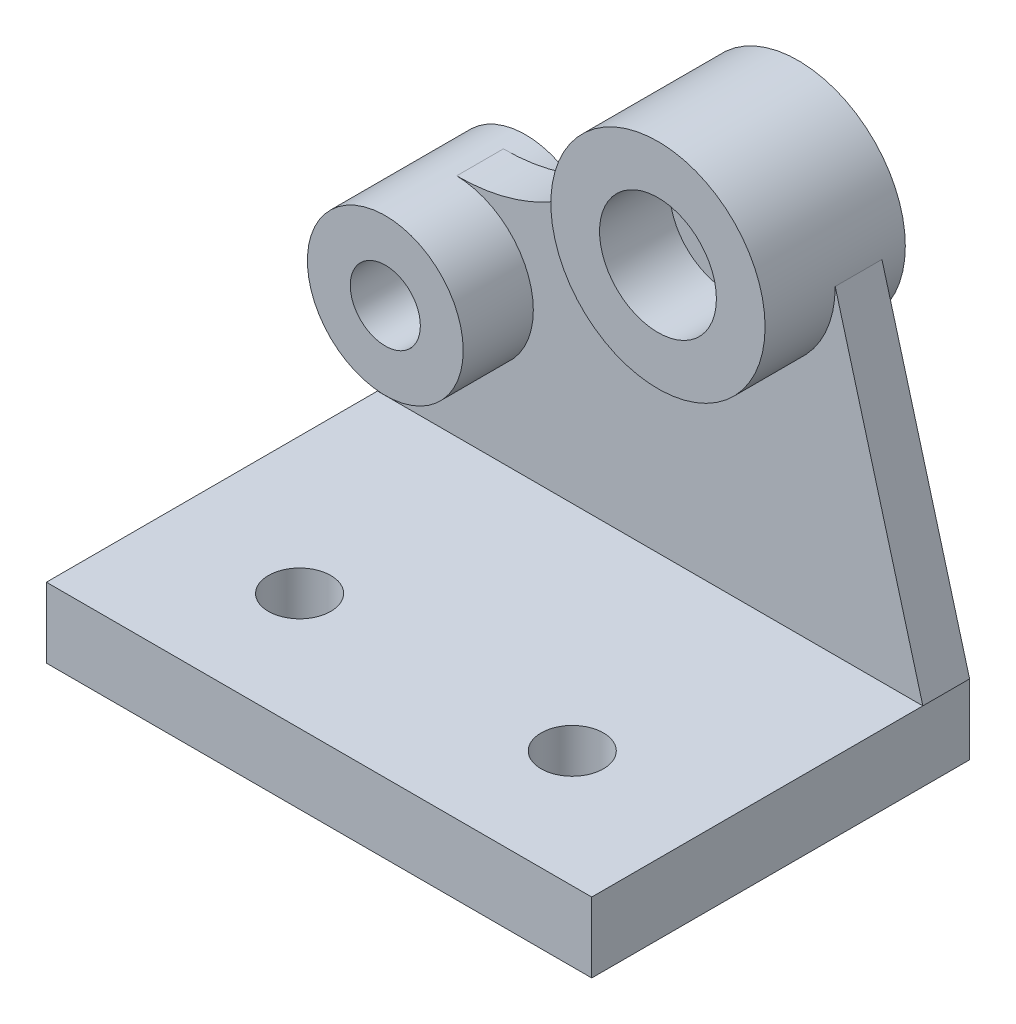
ISO-10303-21;
HEADER;
FILE_DESCRIPTION(('STEP AP214'),'2;1');
FILE_NAME('part.step','',(''),(''),'','','');
FILE_SCHEMA(('AUTOMOTIVE_DESIGN { 1 0 10303 214 1 1 1 1 }'));
ENDSEC;
DATA;
#1=APPLICATION_CONTEXT('core data for automotive mechanical design processes');
#2=APPLICATION_PROTOCOL_DEFINITION('international standard','automotive_design',2000,#1);
#3=PRODUCT_CONTEXT('',#1,'mechanical');
#4=PRODUCT('Part','Part','',(#3));
#5=PRODUCT_RELATED_PRODUCT_CATEGORY('part','',(#4));
#6=PRODUCT_DEFINITION_FORMATION('','',#4);
#7=PRODUCT_DEFINITION_CONTEXT('part definition',#1,'design');
#8=PRODUCT_DEFINITION('design','',#6,#7);
#9=PRODUCT_DEFINITION_SHAPE('','',#8);
#10=(LENGTH_UNIT() NAMED_UNIT(*) SI_UNIT(.MILLI.,.METRE.));
#11=(NAMED_UNIT(*) PLANE_ANGLE_UNIT() SI_UNIT($,.RADIAN.));
#12=(NAMED_UNIT(*) SI_UNIT($,.STERADIAN.) SOLID_ANGLE_UNIT());
#13=UNCERTAINTY_MEASURE_WITH_UNIT(LENGTH_MEASURE(1.E-05),#10,'distance_accuracy_value','');
#14=(GEOMETRIC_REPRESENTATION_CONTEXT(3) GLOBAL_UNCERTAINTY_ASSIGNED_CONTEXT((#13)) GLOBAL_UNIT_ASSIGNED_CONTEXT((#10,
#11,#12)) REPRESENTATION_CONTEXT('',''));
#15=CARTESIAN_POINT('',(0.,0.,0.));
#16=DIRECTION('',(0.,0.,1.));
#17=DIRECTION('',(1.,0.,0.));
#18=AXIS2_PLACEMENT_3D('',#15,#16,#17);
#19=CARTESIAN_POINT('',(0.,18.,85.));
#20=DIRECTION('',(1.,0.,0.));
#21=DIRECTION('',(0.,1.,0.));
#22=AXIS2_PLACEMENT_3D('',#19,#20,#21);
#23=PLANE('',#22);
#24=DIRECTION('',(0.,1.,0.));
#25=VECTOR('',#24,1.);
#26=CARTESIAN_POINT('',(0.,100.,0.));
#27=LINE('',#26,#25);
#28=CARTESIAN_POINT('',(0.,18.,0.));
#29=VERTEX_POINT('',#28);
#30=CARTESIAN_POINT('',(0.,56.,0.));
#31=VERTEX_POINT('',#30);
#32=EDGE_CURVE('E148',#29,#31,#27,.T.);
#33=ORIENTED_EDGE('',*,*,#32,.T.);
#34=DIRECTION('',(0.,0.,1.));
#35=VECTOR('',#34,1.);
#36=CARTESIAN_POINT('',(0.,56.,-12.));
#37=LINE('',#36,#35);
#38=CARTESIAN_POINT('',(0.,56.,-12.));
#39=VERTEX_POINT('',#38);
#40=EDGE_CURVE('E211',#39,#31,#37,.T.);
#41=ORIENTED_EDGE('',*,*,#40,.F.);
#42=DIRECTION('',(0.,1.,0.));
#43=VECTOR('',#42,1.);
#44=CARTESIAN_POINT('',(0.,100.,-12.));
#45=LINE('',#44,#43);
#46=CARTESIAN_POINT('',(0.,0.,-12.));
#47=VERTEX_POINT('',#46);
#48=EDGE_CURVE('E144',#47,#39,#45,.T.);
#49=ORIENTED_EDGE('',*,*,#48,.F.);
#50=DIRECTION('',(0.,0.,-1.));
#51=VECTOR('',#50,1.);
#52=CARTESIAN_POINT('',(0.,0.,85.));
#53=LINE('',#52,#51);
#54=CARTESIAN_POINT('',(0.,0.,85.));
#55=VERTEX_POINT('',#54);
#56=EDGE_CURVE('E183',#55,#47,#53,.T.);
#57=ORIENTED_EDGE('',*,*,#56,.F.);
#58=DIRECTION('',(0.,-1.,0.));
#59=VECTOR('',#58,1.);
#60=CARTESIAN_POINT('',(0.,18.,85.));
#61=LINE('',#60,#59);
#62=CARTESIAN_POINT('',(0.,18.,85.));
#63=VERTEX_POINT('',#62);
#64=EDGE_CURVE('E165',#63,#55,#61,.T.);
#65=ORIENTED_EDGE('',*,*,#64,.F.);
#66=DIRECTION('',(0.,0.,-1.));
#67=VECTOR('',#66,1.);
#68=CARTESIAN_POINT('',(0.,18.,85.));
#69=LINE('',#68,#67);
#70=EDGE_CURVE('E174',#63,#29,#69,.T.);
#71=ORIENTED_EDGE('',*,*,#70,.T.);
#72=EDGE_LOOP('',(#33,#41,#49,#57,#65,#71));
#73=FACE_BOUND('',#72,.T.);
#74=ADVANCED_FACE('F37',(#73),#23,.F.);
#75=CARTESIAN_POINT('',(0.,0.,85.));
#76=DIRECTION('',(0.,1.,0.));
#77=DIRECTION('',(0.,0.,1.));
#78=AXIS2_PLACEMENT_3D('',#75,#76,#77);
#79=PLANE('',#78);
#80=CARTESIAN_POINT('',(35.,0.,55.));
#81=DIRECTION('',(0.,1.,0.));
#82=DIRECTION('',(-1.,0.,0.));
#83=AXIS2_PLACEMENT_3D('',#80,#81,#82);
#84=CIRCLE('',#83,8.);
#85=CARTESIAN_POINT('',(27.,0.,55.));
#86=VERTEX_POINT('',#85);
#87=EDGE_CURVE('E156',#86,#86,#84,.T.);
#88=ORIENTED_EDGE('',*,*,#87,.T.);
#89=EDGE_LOOP('',(#88));
#90=FACE_BOUND('',#89,.T.);
#91=CARTESIAN_POINT('',(105.,0.,55.));
#92=DIRECTION('',(0.,1.,0.));
#93=DIRECTION('',(-1.,0.,0.));
#94=AXIS2_PLACEMENT_3D('',#91,#92,#93);
#95=CIRCLE('',#94,8.);
#96=CARTESIAN_POINT('',(97.,0.,55.));
#97=VERTEX_POINT('',#96);
#98=EDGE_CURVE('E137',#97,#97,#95,.T.);
#99=ORIENTED_EDGE('',*,*,#98,.T.);
#100=EDGE_LOOP('',(#99));
#101=FACE_BOUND('',#100,.T.);
#102=ORIENTED_EDGE('',*,*,#56,.T.);
#103=DIRECTION('',(-1.,0.,0.));
#104=VECTOR('',#103,1.);
#105=CARTESIAN_POINT('',(0.,0.,-12.));
#106=LINE('',#105,#104);
#107=CARTESIAN_POINT('',(140.,0.,-12.));
#108=VERTEX_POINT('',#107);
#109=EDGE_CURVE('E155',#108,#47,#106,.T.);
#110=ORIENTED_EDGE('',*,*,#109,.F.);
#111=DIRECTION('',(0.,0.,-1.));
#112=VECTOR('',#111,1.);
#113=CARTESIAN_POINT('',(140.,0.,85.));
#114=LINE('',#113,#112);
#115=CARTESIAN_POINT('',(140.,0.,85.));
#116=VERTEX_POINT('',#115);
#117=EDGE_CURVE('E135',#116,#108,#114,.T.);
#118=ORIENTED_EDGE('',*,*,#117,.F.);
#119=DIRECTION('',(1.,0.,0.));
#120=VECTOR('',#119,1.);
#121=CARTESIAN_POINT('',(0.,0.,85.));
#122=LINE('',#121,#120);
#123=EDGE_CURVE('E168',#55,#116,#122,.T.);
#124=ORIENTED_EDGE('',*,*,#123,.F.);
#125=EDGE_LOOP('',(#102,#110,#118,#124));
#126=FACE_BOUND('',#125,.T.);
#127=ADVANCED_FACE('F301',(#90,#101,#126),#79,.F.);
#128=CARTESIAN_POINT('',(140.,0.,85.));
#129=DIRECTION('',(-1.,0.,0.));
#130=DIRECTION('',(0.,0.,1.));
#131=AXIS2_PLACEMENT_3D('',#128,#129,#130);
#132=PLANE('',#131);
#133=DIRECTION('',(0.,-1.,0.));
#134=VECTOR('',#133,1.);
#135=CARTESIAN_POINT('',(140.,0.,-12.));
#136=LINE('',#135,#134);
#137=CARTESIAN_POINT('',(140.,18.,-12.));
#138=VERTEX_POINT('',#137);
#139=EDGE_CURVE('E127',#138,#108,#136,.T.);
#140=ORIENTED_EDGE('',*,*,#139,.F.);
#141=DIRECTION('',(0.,0.,1.));
#142=VECTOR('',#141,1.);
#143=CARTESIAN_POINT('',(140.,18.,-12.));
#144=LINE('',#143,#142);
#145=CARTESIAN_POINT('',(140.,18.,0.));
#146=VERTEX_POINT('',#145);
#147=EDGE_CURVE('E114',#138,#146,#144,.T.);
#148=ORIENTED_EDGE('',*,*,#147,.T.);
#149=DIRECTION('',(0.,0.,-1.));
#150=VECTOR('',#149,1.);
#151=CARTESIAN_POINT('',(140.,18.,85.));
#152=LINE('',#151,#150);
#153=CARTESIAN_POINT('',(140.,18.,85.));
#154=VERTEX_POINT('',#153);
#155=EDGE_CURVE('E179',#154,#146,#152,.T.);
#156=ORIENTED_EDGE('',*,*,#155,.F.);
#157=DIRECTION('',(0.,1.,0.));
#158=VECTOR('',#157,1.);
#159=CARTESIAN_POINT('',(140.,0.,85.));
#160=LINE('',#159,#158);
#161=EDGE_CURVE('E170',#116,#154,#160,.T.);
#162=ORIENTED_EDGE('',*,*,#161,.F.);
#163=ORIENTED_EDGE('',*,*,#117,.T.);
#164=EDGE_LOOP('',(#140,#148,#156,#162,#163));
#165=FACE_BOUND('',#164,.T.);
#166=ADVANCED_FACE('F132',(#165),#132,.F.);
#167=CARTESIAN_POINT('',(140.,18.,85.));
#168=DIRECTION('',(0.,-1.,0.));
#169=DIRECTION('',(1.,0.,0.));
#170=AXIS2_PLACEMENT_3D('',#167,#168,#169);
#171=PLANE('',#170);
#172=CARTESIAN_POINT('',(35.,18.,55.));
#173=DIRECTION('',(0.,1.,0.));
#174=DIRECTION('',(-1.,0.,0.));
#175=AXIS2_PLACEMENT_3D('',#172,#173,#174);
#176=CIRCLE('',#175,8.);
#177=CARTESIAN_POINT('',(27.,18.,55.));
#178=VERTEX_POINT('',#177);
#179=EDGE_CURVE('E160',#178,#178,#176,.T.);
#180=ORIENTED_EDGE('',*,*,#179,.F.);
#181=EDGE_LOOP('',(#180));
#182=FACE_BOUND('',#181,.T.);
#183=CARTESIAN_POINT('',(105.,18.,55.));
#184=DIRECTION('',(0.,1.,0.));
#185=DIRECTION('',(-1.,0.,0.));
#186=AXIS2_PLACEMENT_3D('',#183,#184,#185);
#187=CIRCLE('',#186,8.);
#188=CARTESIAN_POINT('',(97.,18.,55.));
#189=VERTEX_POINT('',#188);
#190=EDGE_CURVE('E141',#189,#189,#187,.T.);
#191=ORIENTED_EDGE('',*,*,#190,.F.);
#192=EDGE_LOOP('',(#191));
#193=FACE_BOUND('',#192,.T.);
#194=DIRECTION('',(-1.,0.,0.));
#195=VECTOR('',#194,1.);
#196=CARTESIAN_POINT('',(140.,18.,0.));
#197=LINE('',#196,#195);
#198=EDGE_CURVE('E159',#146,#29,#197,.T.);
#199=ORIENTED_EDGE('',*,*,#198,.T.);
#200=ORIENTED_EDGE('',*,*,#70,.F.);
#201=DIRECTION('',(-1.,0.,0.));
#202=VECTOR('',#201,1.);
#203=CARTESIAN_POINT('',(140.,18.,85.));
#204=LINE('',#203,#202);
#205=EDGE_CURVE('E172',#154,#63,#204,.T.);
#206=ORIENTED_EDGE('',*,*,#205,.F.);
#207=ORIENTED_EDGE('',*,*,#155,.T.);
#208=EDGE_LOOP('',(#199,#200,#206,#207));
#209=FACE_BOUND('',#208,.T.);
#210=ADVANCED_FACE('F309',(#182,#193,#209),#171,.F.);
#211=CARTESIAN_POINT('',(0.,0.,85.));
#212=DIRECTION('',(0.,0.,1.));
#213=DIRECTION('',(1.,0.,0.));
#214=AXIS2_PLACEMENT_3D('',#211,#212,#213);
#215=PLANE('',#214);
#216=ORIENTED_EDGE('',*,*,#64,.T.);
#217=ORIENTED_EDGE('',*,*,#123,.T.);
#218=ORIENTED_EDGE('',*,*,#161,.T.);
#219=ORIENTED_EDGE('',*,*,#205,.T.);
#220=EDGE_LOOP('',(#216,#217,#218,#219));
#221=FACE_BOUND('',#220,.T.);
#222=ADVANCED_FACE('F315',(#221),#215,.T.);
#223=CARTESIAN_POINT('',(105.,0.,55.));
#224=DIRECTION('',(0.,1.,0.));
#225=DIRECTION('',(-1.,0.,0.));
#226=AXIS2_PLACEMENT_3D('',#223,#224,#225);
#227=CYLINDRICAL_SURFACE('',#226,8.);
#228=ORIENTED_EDGE('',*,*,#98,.F.);
#229=EDGE_LOOP('',(#228));
#230=FACE_BOUND('',#229,.T.);
#231=ORIENTED_EDGE('',*,*,#190,.T.);
#232=EDGE_LOOP('',(#231));
#233=FACE_BOUND('',#232,.T.);
#234=ADVANCED_FACE('F319',(#230,#233),#227,.F.);
#235=CARTESIAN_POINT('',(35.,0.,55.));
#236=DIRECTION('',(0.,1.,0.));
#237=DIRECTION('',(-1.,0.,0.));
#238=AXIS2_PLACEMENT_3D('',#235,#236,#237);
#239=CYLINDRICAL_SURFACE('',#238,8.);
#240=ORIENTED_EDGE('',*,*,#87,.F.);
#241=EDGE_LOOP('',(#240));
#242=FACE_BOUND('',#241,.T.);
#243=ORIENTED_EDGE('',*,*,#179,.T.);
#244=EDGE_LOOP('',(#243));
#245=FACE_BOUND('',#244,.T.);
#246=ADVANCED_FACE('F323',(#242,#245),#239,.F.);
#247=CARTESIAN_POINT('',(0.,0.,0.));
#248=DIRECTION('',(0.,0.,1.));
#249=DIRECTION('',(1.,0.,0.));
#250=AXIS2_PLACEMENT_3D('',#247,#248,#249);
#251=PLANE('',#250);
#252=DIRECTION('',(0.264609761316608,-0.964355574576083,0.));
#253=VECTOR('',#252,1.);
#254=CARTESIAN_POINT('',(134.790636561668,36.9852356419211,0.));
#255=LINE('',#254,#253);
#256=CARTESIAN_POINT('',(117.5,100.,0.));
#257=VERTEX_POINT('',#256);
#258=EDGE_CURVE('E117',#257,#146,#255,.T.);
#259=ORIENTED_EDGE('',*,*,#258,.F.);
#260=CARTESIAN_POINT('',(90.,100.,0.));
#261=DIRECTION('',(0.,0.,1.));
#262=DIRECTION('',(1.,0.,0.));
#263=AXIS2_PLACEMENT_3D('',#260,#261,#262);
#264=CIRCLE('',#263,27.5);
#265=CARTESIAN_POINT('',(62.5,100.,0.));
#266=VERTEX_POINT('',#265);
#267=EDGE_CURVE('E250',#257,#266,#264,.F.);
#268=ORIENTED_EDGE('',*,*,#267,.T.);
#269=CARTESIAN_POINT('',(20.5417731947503,124.670818300963,0.));
#270=DIRECTION('',(0.,0.,1.));
#271=DIRECTION('',(1.,0.,0.));
#272=AXIS2_PLACEMENT_3D('',#269,#270,#271);
#273=CIRCLE('',#272,48.6738335482208);
#274=CARTESIAN_POINT('',(20.3155573145409,75.9975104345826,0.));
#275=VERTEX_POINT('',#274);
#276=EDGE_CURVE('E51',#275,#266,#273,.T.);
#277=ORIENTED_EDGE('',*,*,#276,.F.);
#278=CARTESIAN_POINT('',(20.,56.,0.));
#279=DIRECTION('',(0.,0.,1.));
#280=DIRECTION('',(1.,0.,0.));
#281=AXIS2_PLACEMENT_3D('',#278,#279,#280);
#282=CIRCLE('',#281,20.);
#283=EDGE_CURVE('E152',#275,#31,#282,.F.);
#284=ORIENTED_EDGE('',*,*,#283,.T.);
#285=ORIENTED_EDGE('',*,*,#32,.F.);
#286=ORIENTED_EDGE('',*,*,#198,.F.);
#287=EDGE_LOOP('',(#259,#268,#277,#284,#285,#286));
#288=FACE_BOUND('',#287,.T.);
#289=ADVANCED_FACE('F293',(#288),#251,.T.);
#290=CARTESIAN_POINT('',(0.,0.,-12.));
#291=DIRECTION('',(0.,0.,1.));
#292=DIRECTION('',(1.,0.,0.));
#293=AXIS2_PLACEMENT_3D('',#290,#291,#292);
#294=PLANE('',#293);
#295=CARTESIAN_POINT('',(90.,100.,-12.));
#296=DIRECTION('',(0.,0.,1.));
#297=DIRECTION('',(1.,0.,0.));
#298=AXIS2_PLACEMENT_3D('',#295,#296,#297);
#299=CIRCLE('',#298,27.5);
#300=CARTESIAN_POINT('',(117.5,100.,-12.));
#301=VERTEX_POINT('',#300);
#302=CARTESIAN_POINT('',(62.5,100.,-12.));
#303=VERTEX_POINT('',#302);
#304=EDGE_CURVE('E11',#301,#303,#299,.F.);
#305=ORIENTED_EDGE('',*,*,#304,.F.);
#306=DIRECTION('',(0.264609761316608,-0.964355574576083,0.));
#307=VECTOR('',#306,1.);
#308=CARTESIAN_POINT('',(134.790636561668,36.9852356419211,-12.));
#309=LINE('',#308,#307);
#310=EDGE_CURVE('E59',#301,#138,#309,.T.);
#311=ORIENTED_EDGE('',*,*,#310,.T.);
#312=ORIENTED_EDGE('',*,*,#139,.T.);
#313=ORIENTED_EDGE('',*,*,#109,.T.);
#314=ORIENTED_EDGE('',*,*,#48,.T.);
#315=CARTESIAN_POINT('',(20.,56.,-12.));
#316=DIRECTION('',(0.,0.,1.));
#317=DIRECTION('',(1.,0.,0.));
#318=AXIS2_PLACEMENT_3D('',#315,#316,#317);
#319=CIRCLE('',#318,20.);
#320=CARTESIAN_POINT('',(20.3155573145409,75.9975104345826,-12.));
#321=VERTEX_POINT('',#320);
#322=EDGE_CURVE('E185',#321,#39,#319,.F.);
#323=ORIENTED_EDGE('',*,*,#322,.F.);
#324=CARTESIAN_POINT('',(20.5417731947503,124.670818300963,-12.));
#325=DIRECTION('',(0.,0.,1.));
#326=DIRECTION('',(1.,0.,0.));
#327=AXIS2_PLACEMENT_3D('',#324,#325,#326);
#328=CIRCLE('',#327,48.6738335482208);
#329=EDGE_CURVE('E219',#321,#303,#328,.T.);
#330=ORIENTED_EDGE('',*,*,#329,.T.);
#331=EDGE_LOOP('',(#305,#311,#312,#313,#314,#323,#330));
#332=FACE_BOUND('',#331,.T.);
#333=ADVANCED_FACE('F125',(#332),#294,.F.);
#334=CARTESIAN_POINT('',(20.,56.,18.));
#335=DIRECTION('',(0.,0.,-1.));
#336=DIRECTION('',(-1.,0.,0.));
#337=AXIS2_PLACEMENT_3D('',#334,#335,#336);
#338=CYLINDRICAL_SURFACE('',#337,20.);
#339=CARTESIAN_POINT('',(20.,56.,-18.));
#340=DIRECTION('',(0.,0.,1.));
#341=DIRECTION('',(1.,0.,0.));
#342=AXIS2_PLACEMENT_3D('',#339,#340,#341);
#343=CIRCLE('',#342,20.);
#344=CARTESIAN_POINT('',(40.,56.,-18.));
#345=VERTEX_POINT('',#344);
#346=EDGE_CURVE('E201',#345,#345,#343,.T.);
#347=ORIENTED_EDGE('',*,*,#346,.T.);
#348=EDGE_LOOP('',(#347));
#349=FACE_BOUND('',#348,.T.);
#350=ORIENTED_EDGE('',*,*,#322,.T.);
#351=ORIENTED_EDGE('',*,*,#40,.T.);
#352=ORIENTED_EDGE('',*,*,#283,.F.);
#353=DIRECTION('',(0.,0.,1.));
#354=VECTOR('',#353,1.);
#355=CARTESIAN_POINT('',(20.3155573145409,75.9975104345826,-12.));
#356=LINE('',#355,#354);
#357=EDGE_CURVE('E214',#321,#275,#356,.T.);
#358=ORIENTED_EDGE('',*,*,#357,.F.);
#359=EDGE_LOOP('',(#350,#351,#352,#358));
#360=FACE_BOUND('',#359,.T.);
#361=CARTESIAN_POINT('',(20.,56.,18.));
#362=DIRECTION('',(0.,0.,1.));
#363=DIRECTION('',(1.,0.,0.));
#364=AXIS2_PLACEMENT_3D('',#361,#362,#363);
#365=CIRCLE('',#364,20.);
#366=CARTESIAN_POINT('',(40.,56.,18.));
#367=VERTEX_POINT('',#366);
#368=EDGE_CURVE('E189',#367,#367,#365,.T.);
#369=ORIENTED_EDGE('',*,*,#368,.F.);
#370=EDGE_LOOP('',(#369));
#371=FACE_BOUND('',#370,.T.);
#372=ADVANCED_FACE('F216',(#349,#360,#371),#338,.T.);
#373=CARTESIAN_POINT('',(20.,56.,-18.));
#374=DIRECTION('',(0.,0.,1.));
#375=DIRECTION('',(1.,0.,0.));
#376=AXIS2_PLACEMENT_3D('',#373,#374,#375);
#377=PLANE('',#376);
#378=ORIENTED_EDGE('',*,*,#346,.F.);
#379=EDGE_LOOP('',(#378));
#380=FACE_BOUND('',#379,.T.);
#381=CARTESIAN_POINT('',(20.,56.,-18.));
#382=DIRECTION('',(0.,0.,1.));
#383=DIRECTION('',(1.,0.,0.));
#384=AXIS2_PLACEMENT_3D('',#381,#382,#383);
#385=CIRCLE('',#384,9.);
#386=CARTESIAN_POINT('',(29.,56.,-18.));
#387=VERTEX_POINT('',#386);
#388=EDGE_CURVE('E252',#387,#387,#385,.T.);
#389=ORIENTED_EDGE('',*,*,#388,.T.);
#390=EDGE_LOOP('',(#389));
#391=FACE_BOUND('',#390,.T.);
#392=ADVANCED_FACE('F264',(#380,#391),#377,.F.);
#393=CARTESIAN_POINT('',(20.,56.,18.));
#394=DIRECTION('',(0.,0.,-1.));
#395=DIRECTION('',(-1.,0.,0.));
#396=AXIS2_PLACEMENT_3D('',#393,#394,#395);
#397=CYLINDRICAL_SURFACE('',#396,9.);
#398=ORIENTED_EDGE('',*,*,#388,.F.);
#399=EDGE_LOOP('',(#398));
#400=FACE_BOUND('',#399,.T.);
#401=CARTESIAN_POINT('',(20.,56.,-12.));
#402=DIRECTION('',(0.,0.,1.));
#403=DIRECTION('',(1.,0.,0.));
#404=AXIS2_PLACEMENT_3D('',#401,#402,#403);
#405=CIRCLE('',#404,9.);
#406=CARTESIAN_POINT('',(29.,56.,-12.));
#407=VERTEX_POINT('',#406);
#408=EDGE_CURVE('E186',#407,#407,#405,.F.);
#409=ORIENTED_EDGE('',*,*,#408,.F.);
#410=EDGE_LOOP('',(#409));
#411=FACE_BOUND('',#410,.T.);
#412=ADVANCED_FACE('F267',(#400,#411),#397,.F.);
#413=CARTESIAN_POINT('',(20.,56.,18.));
#414=DIRECTION('',(0.,0.,1.));
#415=DIRECTION('',(1.,0.,0.));
#416=AXIS2_PLACEMENT_3D('',#413,#414,#415);
#417=PLANE('',#416);
#418=ORIENTED_EDGE('',*,*,#368,.T.);
#419=EDGE_LOOP('',(#418));
#420=FACE_BOUND('',#419,.T.);
#421=CARTESIAN_POINT('',(20.,56.,18.));
#422=DIRECTION('',(0.,0.,1.));
#423=DIRECTION('',(1.,0.,0.));
#424=AXIS2_PLACEMENT_3D('',#421,#422,#423);
#425=CIRCLE('',#424,9.);
#426=CARTESIAN_POINT('',(29.,56.,18.));
#427=VERTEX_POINT('',#426);
#428=EDGE_CURVE('E253',#427,#427,#425,.T.);
#429=ORIENTED_EDGE('',*,*,#428,.F.);
#430=EDGE_LOOP('',(#429));
#431=FACE_BOUND('',#430,.T.);
#432=ADVANCED_FACE('F273',(#420,#431),#417,.T.);
#433=CARTESIAN_POINT('',(20.,56.,0.));
#434=DIRECTION('',(0.,0.,1.));
#435=DIRECTION('',(1.,0.,0.));
#436=AXIS2_PLACEMENT_3D('',#433,#434,#435);
#437=CIRCLE('',#436,9.);
#438=CARTESIAN_POINT('',(29.,56.,0.));
#439=VERTEX_POINT('',#438);
#440=EDGE_CURVE('E191',#439,#439,#437,.F.);
#441=ORIENTED_EDGE('',*,*,#440,.T.);
#442=EDGE_LOOP('',(#441));
#443=FACE_BOUND('',#442,.T.);
#444=ORIENTED_EDGE('',*,*,#428,.T.);
#445=EDGE_LOOP('',(#444));
#446=FACE_BOUND('',#445,.T.);
#447=ADVANCED_FACE('F275',(#443,#446),#397,.F.);
#448=ORIENTED_EDGE('',*,*,#440,.F.);
#449=EDGE_LOOP('',(#448));
#450=FACE_BOUND('',#449,.T.);
#451=ADVANCED_FACE('F281',(#450),#251,.T.);
#452=ORIENTED_EDGE('',*,*,#408,.T.);
#453=EDGE_LOOP('',(#452));
#454=FACE_BOUND('',#453,.T.);
#455=ADVANCED_FACE('F278',(#454),#294,.F.);
#456=CARTESIAN_POINT('',(90.,100.,18.));
#457=DIRECTION('',(0.,0.,1.));
#458=DIRECTION('',(1.,0.,0.));
#459=AXIS2_PLACEMENT_3D('',#456,#457,#458);
#460=PLANE('',#459);
#461=CARTESIAN_POINT('',(90.,100.,18.));
#462=DIRECTION('',(0.,0.,1.));
#463=DIRECTION('',(1.,0.,0.));
#464=AXIS2_PLACEMENT_3D('',#461,#462,#463);
#465=CIRCLE('',#464,27.5);
#466=CARTESIAN_POINT('',(117.5,100.,18.));
#467=VERTEX_POINT('',#466);
#468=EDGE_CURVE('E122',#467,#467,#465,.T.);
#469=ORIENTED_EDGE('',*,*,#468,.T.);
#470=EDGE_LOOP('',(#469));
#471=FACE_BOUND('',#470,.T.);
#472=CARTESIAN_POINT('',(90.,100.,18.));
#473=DIRECTION('',(0.,0.,1.));
#474=DIRECTION('',(1.,0.,0.));
#475=AXIS2_PLACEMENT_3D('',#472,#473,#474);
#476=CIRCLE('',#475,15.);
#477=CARTESIAN_POINT('',(105.,100.,18.));
#478=VERTEX_POINT('',#477);
#479=EDGE_CURVE('E231',#478,#478,#476,.T.);
#480=ORIENTED_EDGE('',*,*,#479,.F.);
#481=EDGE_LOOP('',(#480));
#482=FACE_BOUND('',#481,.T.);
#483=ADVANCED_FACE('F280',(#471,#482),#460,.T.);
#484=CARTESIAN_POINT('',(90.,100.,-18.));
#485=DIRECTION('',(0.,0.,1.));
#486=DIRECTION('',(1.,0.,0.));
#487=AXIS2_PLACEMENT_3D('',#484,#485,#486);
#488=PLANE('',#487);
#489=CARTESIAN_POINT('',(90.,100.,-18.));
#490=DIRECTION('',(0.,0.,1.));
#491=DIRECTION('',(1.,0.,0.));
#492=AXIS2_PLACEMENT_3D('',#489,#490,#491);
#493=CIRCLE('',#492,27.5);
#494=CARTESIAN_POINT('',(117.5,100.,-18.));
#495=VERTEX_POINT('',#494);
#496=EDGE_CURVE('E228',#495,#495,#493,.T.);
#497=ORIENTED_EDGE('',*,*,#496,.F.);
#498=EDGE_LOOP('',(#497));
#499=FACE_BOUND('',#498,.T.);
#500=CARTESIAN_POINT('',(90.,100.,-18.));
#501=DIRECTION('',(0.,0.,1.));
#502=DIRECTION('',(1.,0.,0.));
#503=AXIS2_PLACEMENT_3D('',#500,#501,#502);
#504=CIRCLE('',#503,15.);
#505=CARTESIAN_POINT('',(105.,100.,-18.));
#506=VERTEX_POINT('',#505);
#507=EDGE_CURVE('E234',#506,#506,#504,.T.);
#508=ORIENTED_EDGE('',*,*,#507,.T.);
#509=EDGE_LOOP('',(#508));
#510=FACE_BOUND('',#509,.T.);
#511=ADVANCED_FACE('F288',(#499,#510),#488,.F.);
#512=CARTESIAN_POINT('',(90.,100.,18.));
#513=DIRECTION('',(0.,0.,-1.));
#514=DIRECTION('',(-1.,0.,0.));
#515=AXIS2_PLACEMENT_3D('',#512,#513,#514);
#516=CYLINDRICAL_SURFACE('',#515,27.5);
#517=ORIENTED_EDGE('',*,*,#267,.F.);
#518=DIRECTION('',(0.,0.,-1.));
#519=VECTOR('',#518,1.);
#520=CARTESIAN_POINT('',(117.5,100.,18.));
#521=LINE('',#520,#519);
#522=EDGE_CURVE('E247',#257,#301,#521,.T.);
#523=ORIENTED_EDGE('',*,*,#522,.T.);
#524=ORIENTED_EDGE('',*,*,#304,.T.);
#525=DIRECTION('',(0.,0.,-1.));
#526=VECTOR('',#525,1.);
#527=CARTESIAN_POINT('',(62.5,100.,18.));
#528=LINE('',#527,#526);
#529=EDGE_CURVE('E223',#303,#266,#528,.F.);
#530=ORIENTED_EDGE('',*,*,#529,.T.);
#531=EDGE_LOOP('',(#517,#523,#524,#530));
#532=FACE_BOUND('',#531,.T.);
#533=ORIENTED_EDGE('',*,*,#468,.F.);
#534=EDGE_LOOP('',(#533));
#535=FACE_BOUND('',#534,.T.);
#536=ORIENTED_EDGE('',*,*,#496,.T.);
#537=EDGE_LOOP('',(#536));
#538=FACE_BOUND('',#537,.T.);
#539=ADVANCED_FACE('F345',(#532,#535,#538),#516,.T.);
#540=CARTESIAN_POINT('',(90.,100.,18.));
#541=DIRECTION('',(0.,0.,-1.));
#542=DIRECTION('',(-1.,0.,0.));
#543=AXIS2_PLACEMENT_3D('',#540,#541,#542);
#544=CYLINDRICAL_SURFACE('',#543,15.);
#545=DIRECTION('',(0.,0.,-1.));
#546=VECTOR('',#545,1.);
#547=CARTESIAN_POINT('',(105.,100.,18.));
#548=LINE('',#547,#546);
#549=CARTESIAN_POINT('',(105.,100.,0.));
#550=VERTEX_POINT('',#549);
#551=CARTESIAN_POINT('',(105.,100.,-12.));
#552=VERTEX_POINT('',#551);
#553=EDGE_CURVE('E237',#550,#552,#548,.T.);
#554=ORIENTED_EDGE('',*,*,#553,.F.);
#555=CARTESIAN_POINT('',(90.,100.,0.));
#556=DIRECTION('',(0.,0.,1.));
#557=DIRECTION('',(1.,0.,0.));
#558=AXIS2_PLACEMENT_3D('',#555,#556,#557);
#559=CIRCLE('',#558,15.);
#560=CARTESIAN_POINT('',(75.,100.,0.));
#561=VERTEX_POINT('',#560);
#562=EDGE_CURVE('E245',#550,#561,#559,.F.);
#563=ORIENTED_EDGE('',*,*,#562,.T.);
#564=DIRECTION('',(0.,0.,-1.));
#565=VECTOR('',#564,1.);
#566=CARTESIAN_POINT('',(75.,100.,18.));
#567=LINE('',#566,#565);
#568=CARTESIAN_POINT('',(75.,100.,-12.));
#569=VERTEX_POINT('',#568);
#570=EDGE_CURVE('E242',#569,#561,#567,.F.);
#571=ORIENTED_EDGE('',*,*,#570,.F.);
#572=CARTESIAN_POINT('',(90.,100.,-12.));
#573=DIRECTION('',(0.,0.,1.));
#574=DIRECTION('',(1.,0.,0.));
#575=AXIS2_PLACEMENT_3D('',#572,#573,#574);
#576=CIRCLE('',#575,15.);
#577=EDGE_CURVE('E44',#552,#569,#576,.F.);
#578=ORIENTED_EDGE('',*,*,#577,.F.);
#579=EDGE_LOOP('',(#554,#563,#571,#578));
#580=FACE_BOUND('',#579,.T.);
#581=ORIENTED_EDGE('',*,*,#479,.T.);
#582=EDGE_LOOP('',(#581));
#583=FACE_BOUND('',#582,.T.);
#584=ORIENTED_EDGE('',*,*,#507,.F.);
#585=EDGE_LOOP('',(#584));
#586=FACE_BOUND('',#585,.T.);
#587=ADVANCED_FACE('F299',(#580,#583,#586),#544,.F.);
#588=DIRECTION('',(1.,0.,0.));
#589=VECTOR('',#588,1.);
#590=CARTESIAN_POINT('',(140.,100.,-12.));
#591=LINE('',#590,#589);
#592=EDGE_CURVE('E138',#569,#552,#591,.T.);
#593=ORIENTED_EDGE('',*,*,#592,.T.);
#594=ORIENTED_EDGE('',*,*,#577,.T.);
#595=EDGE_LOOP('',(#593,#594));
#596=FACE_BOUND('',#595,.T.);
#597=ADVANCED_FACE('F283',(#596),#294,.F.);
#598=CARTESIAN_POINT('',(140.,100.,-12.));
#599=DIRECTION('',(0.,-1.,0.));
#600=DIRECTION('',(0.,0.,-1.));
#601=AXIS2_PLACEMENT_3D('',#598,#599,#600);
#602=PLANE('',#601);
#603=ORIENTED_EDGE('',*,*,#592,.F.);
#604=ORIENTED_EDGE('',*,*,#570,.T.);
#605=DIRECTION('',(1.,0.,0.));
#606=VECTOR('',#605,1.);
#607=CARTESIAN_POINT('',(140.,100.,0.));
#608=LINE('',#607,#606);
#609=EDGE_CURVE('E151',#561,#550,#608,.T.);
#610=ORIENTED_EDGE('',*,*,#609,.T.);
#611=ORIENTED_EDGE('',*,*,#553,.T.);
#612=EDGE_LOOP('',(#603,#604,#610,#611));
#613=FACE_BOUND('',#612,.T.);
#614=ADVANCED_FACE('F298',(#613),#602,.F.);
#615=ORIENTED_EDGE('',*,*,#562,.F.);
#616=ORIENTED_EDGE('',*,*,#609,.F.);
#617=EDGE_LOOP('',(#615,#616));
#618=FACE_BOUND('',#617,.T.);
#619=ADVANCED_FACE('F294',(#618),#251,.T.);
#620=CARTESIAN_POINT('',(20.5417731947503,124.670818300963,-12.));
#621=DIRECTION('',(0.,0.,1.));
#622=DIRECTION('',(1.,0.,0.));
#623=AXIS2_PLACEMENT_3D('',#620,#621,#622);
#624=CYLINDRICAL_SURFACE('',#623,48.6738335482208);
#625=ORIENTED_EDGE('',*,*,#276,.T.);
#626=ORIENTED_EDGE('',*,*,#529,.F.);
#627=ORIENTED_EDGE('',*,*,#329,.F.);
#628=ORIENTED_EDGE('',*,*,#357,.T.);
#629=EDGE_LOOP('',(#625,#626,#627,#628));
#630=FACE_BOUND('',#629,.T.);
#631=ADVANCED_FACE('F221',(#630),#624,.F.);
#632=CARTESIAN_POINT('',(134.790636561668,36.9852356419211,-12.));
#633=DIRECTION('',(-0.964355574576083,-0.264609761316608,0.));
#634=DIRECTION('',(0.264609761316608,-0.964355574576083,0.));
#635=AXIS2_PLACEMENT_3D('',#632,#633,#634);
#636=PLANE('',#635);
#637=ORIENTED_EDGE('',*,*,#258,.T.);
#638=ORIENTED_EDGE('',*,*,#147,.F.);
#639=ORIENTED_EDGE('',*,*,#310,.F.);
#640=ORIENTED_EDGE('',*,*,#522,.F.);
#641=EDGE_LOOP('',(#637,#638,#639,#640));
#642=FACE_BOUND('',#641,.T.);
#643=ADVANCED_FACE('F115',(#642),#636,.F.);
#644=CLOSED_SHELL('',(#74,#127,#166,#210,#222,#234,#246,#289,#333,#372,#392,#412,#432,#447,#451,
#455,#483,#511,#539,#587,#597,#614,#619,#631,#643));
#645=MANIFOLD_SOLID_BREP('B2',#644);
#646=ADVANCED_BREP_SHAPE_REPRESENTATION('',(#18,#645),#14);
#647=SHAPE_DEFINITION_REPRESENTATION(#9,#646);
ENDSEC;
END-ISO-10303-21;
